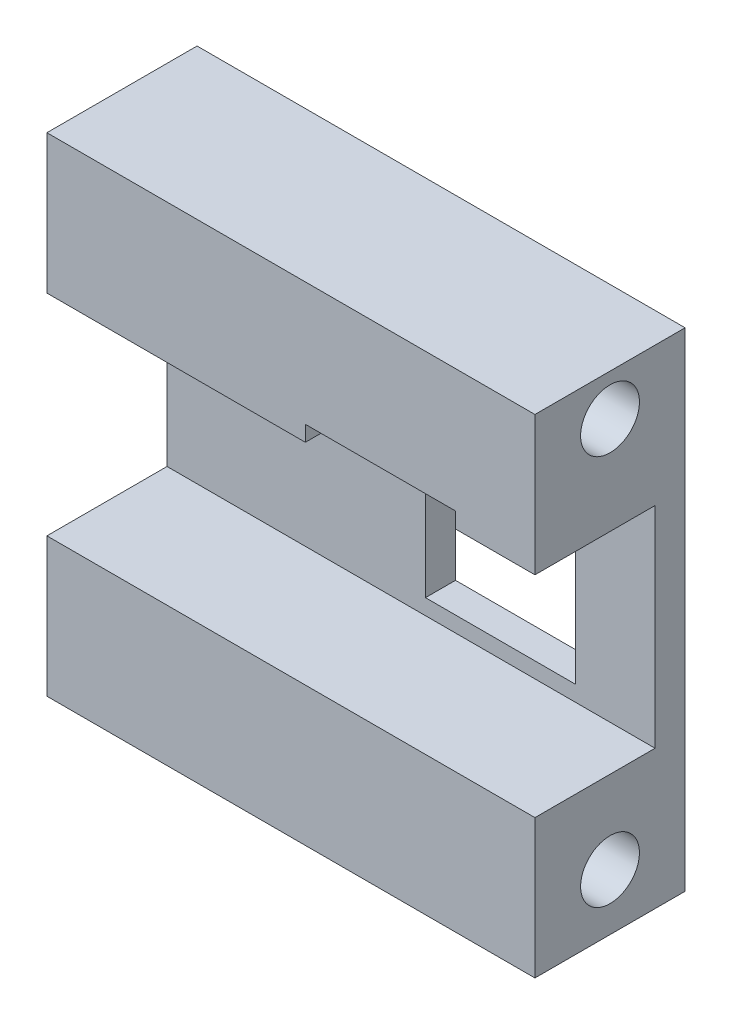
ISO-10303-21;
HEADER;
FILE_DESCRIPTION(('STEP AP214'),'2;1');
FILE_NAME('part.step','',(''),(''),'','','');
FILE_SCHEMA(('AUTOMOTIVE_DESIGN { 1 0 10303 214 1 1 1 1 }'));
ENDSEC;
DATA;
#1=APPLICATION_CONTEXT('core data for automotive mechanical design processes');
#2=APPLICATION_PROTOCOL_DEFINITION('international standard','automotive_design',2000,#1);
#3=PRODUCT_CONTEXT('',#1,'mechanical');
#4=PRODUCT('Part','Part','',(#3));
#5=PRODUCT_RELATED_PRODUCT_CATEGORY('part','',(#4));
#6=PRODUCT_DEFINITION_FORMATION('','',#4);
#7=PRODUCT_DEFINITION_CONTEXT('part definition',#1,'design');
#8=PRODUCT_DEFINITION('design','',#6,#7);
#9=PRODUCT_DEFINITION_SHAPE('','',#8);
#10=(LENGTH_UNIT() NAMED_UNIT(*) SI_UNIT(.MILLI.,.METRE.));
#11=(NAMED_UNIT(*) PLANE_ANGLE_UNIT() SI_UNIT($,.RADIAN.));
#12=(NAMED_UNIT(*) SI_UNIT($,.STERADIAN.) SOLID_ANGLE_UNIT());
#13=UNCERTAINTY_MEASURE_WITH_UNIT(LENGTH_MEASURE(1.E-05),#10,'distance_accuracy_value','');
#14=(GEOMETRIC_REPRESENTATION_CONTEXT(3) GLOBAL_UNCERTAINTY_ASSIGNED_CONTEXT((#13)) GLOBAL_UNIT_ASSIGNED_CONTEXT((#10,
#11,#12)) REPRESENTATION_CONTEXT('',''));
#15=CARTESIAN_POINT('',(0.,0.,0.));
#16=DIRECTION('',(0.,0.,1.));
#17=DIRECTION('',(1.,0.,0.));
#18=AXIS2_PLACEMENT_3D('',#15,#16,#17);
#19=CARTESIAN_POINT('',(0.,0.,38.1));
#20=DIRECTION('',(0.,0.,1.));
#21=DIRECTION('',(1.,0.,0.));
#22=AXIS2_PLACEMENT_3D('',#19,#20,#21);
#23=PLANE('',#22);
#24=DIRECTION('',(1.,0.,0.));
#25=VECTOR('',#24,1.);
#26=CARTESIAN_POINT('',(0.,42.8625,38.1));
#27=LINE('',#26,#25);
#28=CARTESIAN_POINT('',(1.5875,42.8625,38.1));
#29=VERTEX_POINT('',#28);
#30=CARTESIAN_POINT('',(42.8625,42.8625,38.1));
#31=VERTEX_POINT('',#30);
#32=EDGE_CURVE('E167',#29,#31,#27,.T.);
#33=ORIENTED_EDGE('',*,*,#32,.F.);
#34=DIRECTION('',(0.,-1.,0.));
#35=VECTOR('',#34,1.);
#36=CARTESIAN_POINT('',(1.5875,0.,38.1));
#37=LINE('',#36,#35);
#38=CARTESIAN_POINT('',(1.5875,31.1149999999999,38.1));
#39=VERTEX_POINT('',#38);
#40=EDGE_CURVE('E144',#29,#39,#37,.T.);
#41=ORIENTED_EDGE('',*,*,#40,.T.);
#42=DIRECTION('',(1.,0.,0.));
#43=VECTOR('',#42,1.);
#44=CARTESIAN_POINT('',(-3.17500000000006,31.1149999999999,38.1));
#45=LINE('',#44,#43);
#46=CARTESIAN_POINT('',(23.445,31.1149999999999,38.1));
#47=VERTEX_POINT('',#46);
#48=EDGE_CURVE('E39',#39,#47,#45,.T.);
#49=ORIENTED_EDGE('',*,*,#48,.T.);
#50=DIRECTION('',(0.,1.,0.));
#51=VECTOR('',#50,1.);
#52=CARTESIAN_POINT('',(23.445,32.435,38.1));
#53=LINE('',#52,#51);
#54=CARTESIAN_POINT('',(23.445,32.435,38.1));
#55=VERTEX_POINT('',#54);
#56=EDGE_CURVE('E234',#47,#55,#53,.T.);
#57=ORIENTED_EDGE('',*,*,#56,.T.);
#58=DIRECTION('',(1.,0.,0.));
#59=VECTOR('',#58,1.);
#60=CARTESIAN_POINT('',(23.445,32.435,38.1));
#61=LINE('',#60,#59);
#62=CARTESIAN_POINT('',(36.145,32.435,38.1));
#63=VERTEX_POINT('',#62);
#64=EDGE_CURVE('E212',#55,#63,#61,.T.);
#65=ORIENTED_EDGE('',*,*,#64,.T.);
#66=DIRECTION('',(0.,-1.,0.));
#67=VECTOR('',#66,1.);
#68=CARTESIAN_POINT('',(36.145,32.435,38.1));
#69=LINE('',#68,#67);
#70=CARTESIAN_POINT('',(36.145,31.1149999999999,38.1));
#71=VERTEX_POINT('',#70);
#72=EDGE_CURVE('E222',#63,#71,#69,.T.);
#73=ORIENTED_EDGE('',*,*,#72,.T.);
#74=CARTESIAN_POINT('',(42.8625,31.1149999999999,38.1));
#75=VERTEX_POINT('',#74);
#76=EDGE_CURVE('E11',#71,#75,#45,.T.);
#77=ORIENTED_EDGE('',*,*,#76,.T.);
#78=DIRECTION('',(0.,-1.,0.));
#79=VECTOR('',#78,1.);
#80=CARTESIAN_POINT('',(42.8625,0.,38.1));
#81=LINE('',#80,#79);
#82=EDGE_CURVE('E161',#31,#75,#81,.T.);
#83=ORIENTED_EDGE('',*,*,#82,.F.);
#84=EDGE_LOOP('',(#33,#41,#49,#57,#65,#73,#77,#83));
#85=FACE_BOUND('',#84,.T.);
#86=ADVANCED_FACE('F35',(#85),#23,.T.);
#87=CARTESIAN_POINT('',(-3.17500000000006,31.1149999999999,38.1));
#88=DIRECTION('',(0.,-1.,0.));
#89=DIRECTION('',(1.,0.,0.));
#90=AXIS2_PLACEMENT_3D('',#87,#88,#89);
#91=PLANE('',#90);
#92=ORIENTED_EDGE('',*,*,#48,.F.);
#93=DIRECTION('',(0.,0.,-1.));
#94=VECTOR('',#93,1.);
#95=CARTESIAN_POINT('',(1.5875,31.1149999999999,38.1));
#96=LINE('',#95,#94);
#97=CARTESIAN_POINT('',(1.5875,31.1149999999999,27.94));
#98=VERTEX_POINT('',#97);
#99=EDGE_CURVE('E195',#39,#98,#96,.T.);
#100=ORIENTED_EDGE('',*,*,#99,.T.);
#101=DIRECTION('',(1.,0.,0.));
#102=VECTOR('',#101,1.);
#103=CARTESIAN_POINT('',(-3.17500000000006,31.1149999999999,27.94));
#104=LINE('',#103,#102);
#105=CARTESIAN_POINT('',(23.445,31.1149999999999,27.94));
#106=VERTEX_POINT('',#105);
#107=EDGE_CURVE('E244',#98,#106,#104,.T.);
#108=ORIENTED_EDGE('',*,*,#107,.T.);
#109=DIRECTION('',(0.,0.,1.));
#110=VECTOR('',#109,1.);
#111=CARTESIAN_POINT('',(23.445,31.1149999999999,38.1));
#112=LINE('',#111,#110);
#113=EDGE_CURVE('E204',#106,#47,#112,.T.);
#114=ORIENTED_EDGE('',*,*,#113,.T.);
#115=EDGE_LOOP('',(#92,#100,#108,#114));
#116=FACE_BOUND('',#115,.T.);
#117=ADVANCED_FACE('F259',(#116),#91,.T.);
#118=CARTESIAN_POINT('',(-3.17500000000006,31.1149999999999,27.94));
#119=DIRECTION('',(0.,0.,1.));
#120=DIRECTION('',(1.,0.,0.));
#121=AXIS2_PLACEMENT_3D('',#118,#119,#120);
#122=PLANE('',#121);
#123=ORIENTED_EDGE('',*,*,#107,.F.);
#124=DIRECTION('',(0.,-1.,0.));
#125=VECTOR('',#124,1.);
#126=CARTESIAN_POINT('',(1.5875,31.1149999999999,27.94));
#127=LINE('',#126,#125);
#128=CARTESIAN_POINT('',(1.5875,13.3349999999999,27.94));
#129=VERTEX_POINT('',#128);
#130=EDGE_CURVE('E192',#98,#129,#127,.T.);
#131=ORIENTED_EDGE('',*,*,#130,.T.);
#132=DIRECTION('',(1.,0.,0.));
#133=VECTOR('',#132,1.);
#134=CARTESIAN_POINT('',(-3.17500000000004,13.3349999999999,27.94));
#135=LINE('',#134,#133);
#136=CARTESIAN_POINT('',(42.8625,13.3349999999999,27.94));
#137=VERTEX_POINT('',#136);
#138=EDGE_CURVE('E247',#129,#137,#135,.T.);
#139=ORIENTED_EDGE('',*,*,#138,.T.);
#140=DIRECTION('',(0.,-1.,0.));
#141=VECTOR('',#140,1.);
#142=CARTESIAN_POINT('',(42.8625,31.1149999999999,27.94));
#143=LINE('',#142,#141);
#144=CARTESIAN_POINT('',(42.8625,31.1149999999999,27.94));
#145=VERTEX_POINT('',#144);
#146=EDGE_CURVE('E50',#145,#137,#143,.T.);
#147=ORIENTED_EDGE('',*,*,#146,.F.);
#148=CARTESIAN_POINT('',(36.145,31.1149999999999,27.94));
#149=VERTEX_POINT('',#148);
#150=EDGE_CURVE('E246',#149,#145,#104,.T.);
#151=ORIENTED_EDGE('',*,*,#150,.F.);
#152=DIRECTION('',(0.,-1.,0.));
#153=VECTOR('',#152,1.);
#154=CARTESIAN_POINT('',(36.145,32.435,27.94));
#155=LINE('',#154,#153);
#156=CARTESIAN_POINT('',(36.145,14.655,27.94));
#157=VERTEX_POINT('',#156);
#158=EDGE_CURVE('E239',#149,#157,#155,.T.);
#159=ORIENTED_EDGE('',*,*,#158,.T.);
#160=DIRECTION('',(-1.,0.,0.));
#161=VECTOR('',#160,1.);
#162=CARTESIAN_POINT('',(23.445,14.655,27.94));
#163=LINE('',#162,#161);
#164=CARTESIAN_POINT('',(23.445,14.655,27.94));
#165=VERTEX_POINT('',#164);
#166=EDGE_CURVE('E207',#157,#165,#163,.T.);
#167=ORIENTED_EDGE('',*,*,#166,.T.);
#168=DIRECTION('',(0.,1.,0.));
#169=VECTOR('',#168,1.);
#170=CARTESIAN_POINT('',(23.445,32.435,27.94));
#171=LINE('',#170,#169);
#172=EDGE_CURVE('E241',#165,#106,#171,.T.);
#173=ORIENTED_EDGE('',*,*,#172,.T.);
#174=EDGE_LOOP('',(#123,#131,#139,#147,#151,#159,#167,#173));
#175=FACE_BOUND('',#174,.T.);
#176=ADVANCED_FACE('F282',(#175),#122,.T.);
#177=DIRECTION('',(1.,0.,0.));
#178=VECTOR('',#177,1.);
#179=CARTESIAN_POINT('',(-3.17500000000004,13.3349999999999,38.1));
#180=LINE('',#179,#178);
#181=CARTESIAN_POINT('',(1.5875,13.3349999999999,38.1));
#182=VERTEX_POINT('',#181);
#183=CARTESIAN_POINT('',(42.8625,13.3349999999999,38.1));
#184=VERTEX_POINT('',#183);
#185=EDGE_CURVE('E249',#182,#184,#180,.T.);
#186=ORIENTED_EDGE('',*,*,#185,.F.);
#187=CARTESIAN_POINT('',(1.5875,1.5875,38.1));
#188=VERTEX_POINT('',#187);
#189=EDGE_CURVE('E168',#182,#188,#37,.T.);
#190=ORIENTED_EDGE('',*,*,#189,.T.);
#191=DIRECTION('',(1.,0.,0.));
#192=VECTOR('',#191,1.);
#193=CARTESIAN_POINT('',(0.,1.5875,38.1));
#194=LINE('',#193,#192);
#195=CARTESIAN_POINT('',(42.8625,1.5875,38.1));
#196=VERTEX_POINT('',#195);
#197=EDGE_CURVE('E158',#188,#196,#194,.T.);
#198=ORIENTED_EDGE('',*,*,#197,.T.);
#199=EDGE_CURVE('E170',#184,#196,#81,.T.);
#200=ORIENTED_EDGE('',*,*,#199,.F.);
#201=EDGE_LOOP('',(#186,#190,#198,#200));
#202=FACE_BOUND('',#201,.T.);
#203=ADVANCED_FACE('F289',(#202),#23,.T.);
#204=CARTESIAN_POINT('',(-3.17500000000004,13.3349999999999,27.94));
#205=DIRECTION('',(0.,1.,0.));
#206=DIRECTION('',(-1.,0.,0.));
#207=AXIS2_PLACEMENT_3D('',#204,#205,#206);
#208=PLANE('',#207);
#209=ORIENTED_EDGE('',*,*,#138,.F.);
#210=DIRECTION('',(0.,0.,1.));
#211=VECTOR('',#210,1.);
#212=CARTESIAN_POINT('',(1.5875,13.3349999999999,27.94));
#213=LINE('',#212,#211);
#214=EDGE_CURVE('E189',#129,#182,#213,.T.);
#215=ORIENTED_EDGE('',*,*,#214,.T.);
#216=ORIENTED_EDGE('',*,*,#185,.T.);
#217=DIRECTION('',(0.,0.,1.));
#218=VECTOR('',#217,1.);
#219=CARTESIAN_POINT('',(42.8625,13.3349999999999,27.94));
#220=LINE('',#219,#218);
#221=EDGE_CURVE('E174',#137,#184,#220,.T.);
#222=ORIENTED_EDGE('',*,*,#221,.F.);
#223=EDGE_LOOP('',(#209,#215,#216,#222));
#224=FACE_BOUND('',#223,.T.);
#225=ADVANCED_FACE('F37',(#224),#208,.T.);
#226=CARTESIAN_POINT('',(0.,90.6786977969313,25.4));
#227=DIRECTION('',(0.,0.,-1.));
#228=DIRECTION('',(-1.,0.,0.));
#229=AXIS2_PLACEMENT_3D('',#226,#227,#228);
#230=PLANE('',#229);
#231=DIRECTION('',(0.,-1.,0.));
#232=VECTOR('',#231,1.);
#233=CARTESIAN_POINT('',(36.145,32.435,25.4));
#234=LINE('',#233,#232);
#235=CARTESIAN_POINT('',(36.145,32.435,25.4));
#236=VERTEX_POINT('',#235);
#237=CARTESIAN_POINT('',(36.145,14.655,25.4));
#238=VERTEX_POINT('',#237);
#239=EDGE_CURVE('E228',#236,#238,#234,.T.);
#240=ORIENTED_EDGE('',*,*,#239,.F.);
#241=DIRECTION('',(1.,0.,0.));
#242=VECTOR('',#241,1.);
#243=CARTESIAN_POINT('',(23.445,32.435,25.4));
#244=LINE('',#243,#242);
#245=CARTESIAN_POINT('',(23.445,32.435,25.4));
#246=VERTEX_POINT('',#245);
#247=EDGE_CURVE('E218',#246,#236,#244,.T.);
#248=ORIENTED_EDGE('',*,*,#247,.F.);
#249=DIRECTION('',(0.,1.,0.));
#250=VECTOR('',#249,1.);
#251=CARTESIAN_POINT('',(23.445,32.435,25.4));
#252=LINE('',#251,#250);
#253=CARTESIAN_POINT('',(23.445,14.655,25.4));
#254=VERTEX_POINT('',#253);
#255=EDGE_CURVE('E221',#254,#246,#252,.T.);
#256=ORIENTED_EDGE('',*,*,#255,.F.);
#257=DIRECTION('',(-1.,0.,0.));
#258=VECTOR('',#257,1.);
#259=CARTESIAN_POINT('',(23.445,14.655,25.4));
#260=LINE('',#259,#258);
#261=EDGE_CURVE('E225',#238,#254,#260,.T.);
#262=ORIENTED_EDGE('',*,*,#261,.F.);
#263=EDGE_LOOP('',(#240,#248,#256,#262));
#264=FACE_BOUND('',#263,.T.);
#265=DIRECTION('',(1.,0.,0.));
#266=VECTOR('',#265,1.);
#267=CARTESIAN_POINT('',(0.,1.5875,25.4));
#268=LINE('',#267,#266);
#269=CARTESIAN_POINT('',(1.5875,1.5875,25.4));
#270=VERTEX_POINT('',#269);
#271=CARTESIAN_POINT('',(42.8625,1.5875,25.4));
#272=VERTEX_POINT('',#271);
#273=EDGE_CURVE('E149',#270,#272,#268,.T.);
#274=ORIENTED_EDGE('',*,*,#273,.F.);
#275=DIRECTION('',(0.,-1.,0.));
#276=VECTOR('',#275,1.);
#277=CARTESIAN_POINT('',(1.5875,0.,25.4));
#278=LINE('',#277,#276);
#279=CARTESIAN_POINT('',(1.5875,42.8625,25.4));
#280=VERTEX_POINT('',#279);
#281=EDGE_CURVE('E141',#280,#270,#278,.T.);
#282=ORIENTED_EDGE('',*,*,#281,.F.);
#283=DIRECTION('',(1.,0.,0.));
#284=VECTOR('',#283,1.);
#285=CARTESIAN_POINT('',(0.,42.8625,25.4));
#286=LINE('',#285,#284);
#287=CARTESIAN_POINT('',(42.8625,42.8625,25.4));
#288=VERTEX_POINT('',#287);
#289=EDGE_CURVE('E152',#280,#288,#286,.T.);
#290=ORIENTED_EDGE('',*,*,#289,.T.);
#291=DIRECTION('',(0.,-1.,0.));
#292=VECTOR('',#291,1.);
#293=CARTESIAN_POINT('',(42.8625,0.,25.4));
#294=LINE('',#293,#292);
#295=EDGE_CURVE('E57',#288,#272,#294,.T.);
#296=ORIENTED_EDGE('',*,*,#295,.T.);
#297=EDGE_LOOP('',(#274,#282,#290,#296));
#298=FACE_BOUND('',#297,.T.);
#299=ADVANCED_FACE('F157',(#264,#298),#230,.T.);
#300=CARTESIAN_POINT('',(23.445,32.435,38.1));
#301=DIRECTION('',(0.,1.,0.));
#302=DIRECTION('',(0.,0.,1.));
#303=AXIS2_PLACEMENT_3D('',#300,#301,#302);
#304=PLANE('',#303);
#305=ORIENTED_EDGE('',*,*,#247,.T.);
#306=DIRECTION('',(0.,0.,-1.));
#307=VECTOR('',#306,1.);
#308=CARTESIAN_POINT('',(36.145,32.435,38.1));
#309=LINE('',#308,#307);
#310=EDGE_CURVE('E209',#63,#236,#309,.T.);
#311=ORIENTED_EDGE('',*,*,#310,.F.);
#312=ORIENTED_EDGE('',*,*,#64,.F.);
#313=DIRECTION('',(0.,0.,-1.));
#314=VECTOR('',#313,1.);
#315=CARTESIAN_POINT('',(23.445,32.435,38.1));
#316=LINE('',#315,#314);
#317=EDGE_CURVE('E215',#55,#246,#316,.T.);
#318=ORIENTED_EDGE('',*,*,#317,.T.);
#319=EDGE_LOOP('',(#305,#311,#312,#318));
#320=FACE_BOUND('',#319,.T.);
#321=ADVANCED_FACE('F268',(#320),#304,.F.);
#322=CARTESIAN_POINT('',(23.445,32.435,38.1));
#323=DIRECTION('',(-1.,0.,0.));
#324=DIRECTION('',(0.,0.,1.));
#325=AXIS2_PLACEMENT_3D('',#322,#323,#324);
#326=PLANE('',#325);
#327=ORIENTED_EDGE('',*,*,#113,.F.);
#328=ORIENTED_EDGE('',*,*,#172,.F.);
#329=DIRECTION('',(0.,0.,-1.));
#330=VECTOR('',#329,1.);
#331=CARTESIAN_POINT('',(23.445,14.655,38.1));
#332=LINE('',#331,#330);
#333=EDGE_CURVE('E213',#165,#254,#332,.T.);
#334=ORIENTED_EDGE('',*,*,#333,.T.);
#335=ORIENTED_EDGE('',*,*,#255,.T.);
#336=ORIENTED_EDGE('',*,*,#317,.F.);
#337=ORIENTED_EDGE('',*,*,#56,.F.);
#338=EDGE_LOOP('',(#327,#328,#334,#335,#336,#337));
#339=FACE_BOUND('',#338,.T.);
#340=ADVANCED_FACE('F263',(#339),#326,.F.);
#341=CARTESIAN_POINT('',(23.445,14.655,38.1));
#342=DIRECTION('',(0.,-1.,0.));
#343=DIRECTION('',(1.,0.,0.));
#344=AXIS2_PLACEMENT_3D('',#341,#342,#343);
#345=PLANE('',#344);
#346=ORIENTED_EDGE('',*,*,#166,.F.);
#347=DIRECTION('',(0.,0.,-1.));
#348=VECTOR('',#347,1.);
#349=CARTESIAN_POINT('',(36.145,14.655,38.1));
#350=LINE('',#349,#348);
#351=EDGE_CURVE('E210',#157,#238,#350,.T.);
#352=ORIENTED_EDGE('',*,*,#351,.T.);
#353=ORIENTED_EDGE('',*,*,#261,.T.);
#354=ORIENTED_EDGE('',*,*,#333,.F.);
#355=EDGE_LOOP('',(#346,#352,#353,#354));
#356=FACE_BOUND('',#355,.T.);
#357=ADVANCED_FACE('F295',(#356),#345,.F.);
#358=CARTESIAN_POINT('',(36.145,32.435,38.1));
#359=DIRECTION('',(1.,0.,0.));
#360=DIRECTION('',(0.,0.,-1.));
#361=AXIS2_PLACEMENT_3D('',#358,#359,#360);
#362=PLANE('',#361);
#363=DIRECTION('',(0.,0.,-1.));
#364=VECTOR('',#363,1.);
#365=CARTESIAN_POINT('',(36.145,31.1149999999999,38.1));
#366=LINE('',#365,#364);
#367=EDGE_CURVE('E231',#71,#149,#366,.T.);
#368=ORIENTED_EDGE('',*,*,#367,.F.);
#369=ORIENTED_EDGE('',*,*,#72,.F.);
#370=ORIENTED_EDGE('',*,*,#310,.T.);
#371=ORIENTED_EDGE('',*,*,#239,.T.);
#372=ORIENTED_EDGE('',*,*,#351,.F.);
#373=ORIENTED_EDGE('',*,*,#158,.F.);
#374=EDGE_LOOP('',(#368,#369,#370,#371,#372,#373));
#375=FACE_BOUND('',#374,.T.);
#376=ADVANCED_FACE('F273',(#375),#362,.F.);
#377=DIRECTION('',(0.,0.,-1.));
#378=VECTOR('',#377,1.);
#379=CARTESIAN_POINT('',(42.8625,31.1149999999999,38.1));
#380=LINE('',#379,#378);
#381=EDGE_CURVE('E181',#75,#145,#380,.T.);
#382=ORIENTED_EDGE('',*,*,#381,.F.);
#383=ORIENTED_EDGE('',*,*,#76,.F.);
#384=ORIENTED_EDGE('',*,*,#367,.T.);
#385=ORIENTED_EDGE('',*,*,#150,.T.);
#386=EDGE_LOOP('',(#382,#383,#384,#385));
#387=FACE_BOUND('',#386,.T.);
#388=ADVANCED_FACE('F280',(#387),#91,.T.);
#389=CARTESIAN_POINT('',(1.5875,0.,25.4));
#390=DIRECTION('',(-1.,0.,0.));
#391=DIRECTION('',(0.,0.,1.));
#392=AXIS2_PLACEMENT_3D('',#389,#390,#391);
#393=PLANE('',#392);
#394=ORIENTED_EDGE('',*,*,#40,.F.);
#395=DIRECTION('',(0.,0.,1.));
#396=VECTOR('',#395,1.);
#397=CARTESIAN_POINT('',(1.5875,42.8625,25.4));
#398=LINE('',#397,#396);
#399=EDGE_CURVE('E135',#280,#29,#398,.T.);
#400=ORIENTED_EDGE('',*,*,#399,.F.);
#401=ORIENTED_EDGE('',*,*,#281,.T.);
#402=DIRECTION('',(0.,0.,1.));
#403=VECTOR('',#402,1.);
#404=CARTESIAN_POINT('',(1.5875,1.5875,25.4));
#405=LINE('',#404,#403);
#406=EDGE_CURVE('E172',#270,#188,#405,.T.);
#407=ORIENTED_EDGE('',*,*,#406,.T.);
#408=ORIENTED_EDGE('',*,*,#189,.F.);
#409=ORIENTED_EDGE('',*,*,#214,.F.);
#410=ORIENTED_EDGE('',*,*,#130,.F.);
#411=ORIENTED_EDGE('',*,*,#99,.F.);
#412=EDGE_LOOP('',(#394,#400,#401,#407,#408,#409,#410,#411));
#413=FACE_BOUND('',#412,.T.);
#414=CARTESIAN_POINT('',(1.5875,6.35000000000001,31.75));
#415=DIRECTION('',(-1.,0.,0.));
#416=DIRECTION('',(0.,0.,1.));
#417=AXIS2_PLACEMENT_3D('',#414,#415,#416);
#418=CIRCLE('',#417,2.4892);
#419=CARTESIAN_POINT('',(1.5875,6.35000000000001,34.2392));
#420=VERTEX_POINT('',#419);
#421=EDGE_CURVE('E198',#420,#420,#418,.F.);
#422=ORIENTED_EDGE('',*,*,#421,.T.);
#423=EDGE_LOOP('',(#422));
#424=FACE_BOUND('',#423,.T.);
#425=CARTESIAN_POINT('',(1.5875,39.37,31.75));
#426=DIRECTION('',(-1.,0.,0.));
#427=DIRECTION('',(0.,0.,1.));
#428=AXIS2_PLACEMENT_3D('',#425,#426,#427);
#429=CIRCLE('',#428,2.4892);
#430=CARTESIAN_POINT('',(1.5875,39.37,34.2392));
#431=VERTEX_POINT('',#430);
#432=EDGE_CURVE('E201',#431,#431,#429,.F.);
#433=ORIENTED_EDGE('',*,*,#432,.T.);
#434=EDGE_LOOP('',(#433));
#435=FACE_BOUND('',#434,.T.);
#436=ADVANCED_FACE('F137',(#413,#424,#435),#393,.T.);
#437=CARTESIAN_POINT('',(42.8625,0.,25.4));
#438=DIRECTION('',(-1.,0.,0.));
#439=DIRECTION('',(0.,0.,1.));
#440=AXIS2_PLACEMENT_3D('',#437,#438,#439);
#441=PLANE('',#440);
#442=CARTESIAN_POINT('',(42.8625,6.35000000000001,31.75));
#443=DIRECTION('',(-1.,0.,0.));
#444=DIRECTION('',(0.,0.,1.));
#445=AXIS2_PLACEMENT_3D('',#442,#443,#444);
#446=CIRCLE('',#445,2.4892);
#447=CARTESIAN_POINT('',(42.8625,6.35000000000001,34.2392));
#448=VERTEX_POINT('',#447);
#449=EDGE_CURVE('E183',#448,#448,#446,.F.);
#450=ORIENTED_EDGE('',*,*,#449,.F.);
#451=EDGE_LOOP('',(#450));
#452=FACE_BOUND('',#451,.T.);
#453=ORIENTED_EDGE('',*,*,#381,.T.);
#454=ORIENTED_EDGE('',*,*,#146,.T.);
#455=ORIENTED_EDGE('',*,*,#221,.T.);
#456=ORIENTED_EDGE('',*,*,#199,.T.);
#457=DIRECTION('',(0.,0.,1.));
#458=VECTOR('',#457,1.);
#459=CARTESIAN_POINT('',(42.8625,1.5875,25.4));
#460=LINE('',#459,#458);
#461=EDGE_CURVE('E175',#272,#196,#460,.T.);
#462=ORIENTED_EDGE('',*,*,#461,.F.);
#463=ORIENTED_EDGE('',*,*,#295,.F.);
#464=DIRECTION('',(0.,0.,1.));
#465=VECTOR('',#464,1.);
#466=CARTESIAN_POINT('',(42.8625,42.8625,25.4));
#467=LINE('',#466,#465);
#468=EDGE_CURVE('E148',#288,#31,#467,.T.);
#469=ORIENTED_EDGE('',*,*,#468,.T.);
#470=ORIENTED_EDGE('',*,*,#82,.T.);
#471=EDGE_LOOP('',(#453,#454,#455,#456,#462,#463,#469,#470));
#472=FACE_BOUND('',#471,.T.);
#473=CARTESIAN_POINT('',(42.8625,39.37,31.75));
#474=DIRECTION('',(-1.,0.,0.));
#475=DIRECTION('',(0.,0.,1.));
#476=AXIS2_PLACEMENT_3D('',#473,#474,#475);
#477=CIRCLE('',#476,2.4892);
#478=CARTESIAN_POINT('',(42.8625,39.37,34.2392));
#479=VERTEX_POINT('',#478);
#480=EDGE_CURVE('E186',#479,#479,#477,.F.);
#481=ORIENTED_EDGE('',*,*,#480,.F.);
#482=EDGE_LOOP('',(#481));
#483=FACE_BOUND('',#482,.T.);
#484=ADVANCED_FACE('F286',(#452,#472,#483),#441,.F.);
#485=CARTESIAN_POINT('',(0.,1.5875,25.4));
#486=DIRECTION('',(0.,-1.,0.));
#487=DIRECTION('',(1.,0.,0.));
#488=AXIS2_PLACEMENT_3D('',#485,#486,#487);
#489=PLANE('',#488);
#490=ORIENTED_EDGE('',*,*,#197,.F.);
#491=ORIENTED_EDGE('',*,*,#406,.F.);
#492=ORIENTED_EDGE('',*,*,#273,.T.);
#493=ORIENTED_EDGE('',*,*,#461,.T.);
#494=EDGE_LOOP('',(#490,#491,#492,#493));
#495=FACE_BOUND('',#494,.T.);
#496=ADVANCED_FACE('F292',(#495),#489,.T.);
#497=CARTESIAN_POINT('',(0.,42.8625,25.4));
#498=DIRECTION('',(0.,-1.,0.));
#499=DIRECTION('',(0.,0.,-1.));
#500=AXIS2_PLACEMENT_3D('',#497,#498,#499);
#501=PLANE('',#500);
#502=ORIENTED_EDGE('',*,*,#32,.T.);
#503=ORIENTED_EDGE('',*,*,#468,.F.);
#504=ORIENTED_EDGE('',*,*,#289,.F.);
#505=ORIENTED_EDGE('',*,*,#399,.T.);
#506=EDGE_LOOP('',(#502,#503,#504,#505));
#507=FACE_BOUND('',#506,.T.);
#508=ADVANCED_FACE('F153',(#507),#501,.F.);
#509=CARTESIAN_POINT('',(47.625,6.35000000000001,31.75));
#510=DIRECTION('',(-1.,0.,0.));
#511=DIRECTION('',(0.,0.,1.));
#512=AXIS2_PLACEMENT_3D('',#509,#510,#511);
#513=CYLINDRICAL_SURFACE('',#512,2.4892);
#514=ORIENTED_EDGE('',*,*,#449,.T.);
#515=EDGE_LOOP('',(#514));
#516=FACE_BOUND('',#515,.T.);
#517=ORIENTED_EDGE('',*,*,#421,.F.);
#518=EDGE_LOOP('',(#517));
#519=FACE_BOUND('',#518,.T.);
#520=ADVANCED_FACE('F324',(#516,#519),#513,.F.);
#521=CARTESIAN_POINT('',(47.625,39.37,31.75));
#522=DIRECTION('',(-1.,0.,0.));
#523=DIRECTION('',(0.,0.,1.));
#524=AXIS2_PLACEMENT_3D('',#521,#522,#523);
#525=CYLINDRICAL_SURFACE('',#524,2.4892);
#526=ORIENTED_EDGE('',*,*,#480,.T.);
#527=EDGE_LOOP('',(#526));
#528=FACE_BOUND('',#527,.T.);
#529=ORIENTED_EDGE('',*,*,#432,.F.);
#530=EDGE_LOOP('',(#529));
#531=FACE_BOUND('',#530,.T.);
#532=ADVANCED_FACE('F322',(#528,#531),#525,.F.);
#533=CLOSED_SHELL('',(#86,#117,#176,#203,#225,#299,#321,#340,#357,#376,#388,#436,#484,#496,#508,
#520,#532));
#534=MANIFOLD_SOLID_BREP('B2',#533);
#535=ADVANCED_BREP_SHAPE_REPRESENTATION('',(#18,#534),#14);
#536=SHAPE_DEFINITION_REPRESENTATION(#9,#535);
ENDSEC;
END-ISO-10303-21;
